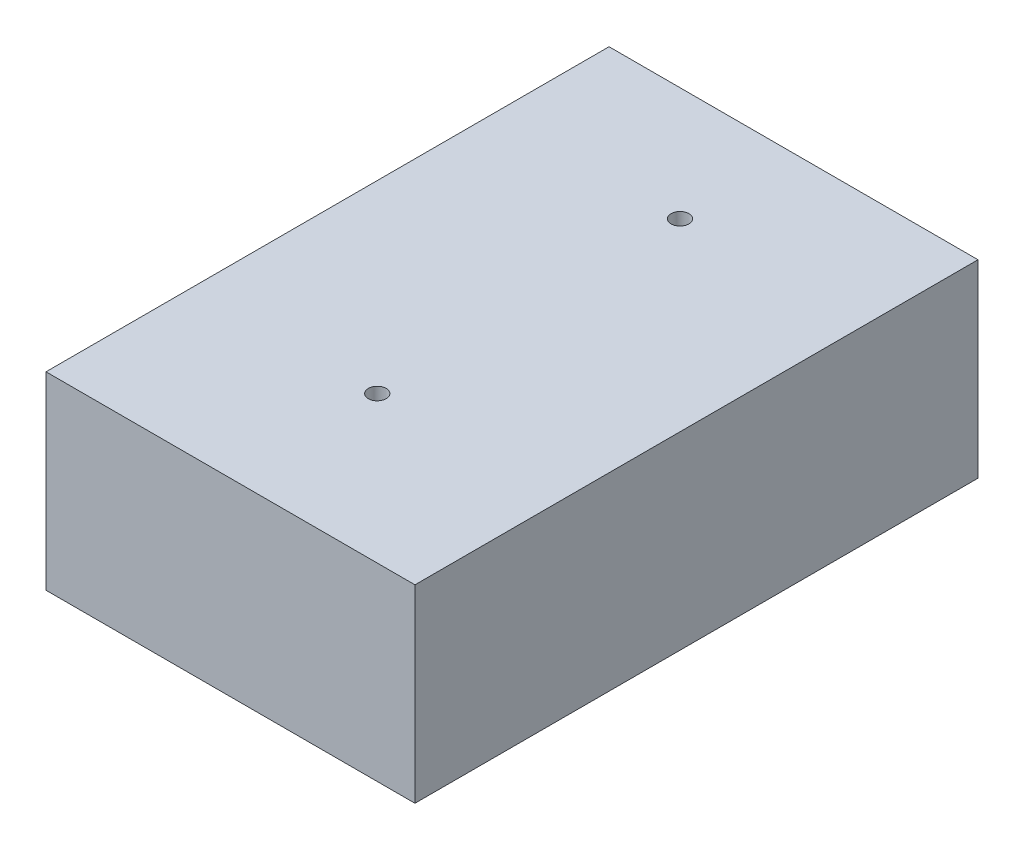
ISO-10303-21;
HEADER;
FILE_DESCRIPTION(('STEP AP214'),'2;1');
FILE_NAME('part.step','',(''),(''),'','','');
FILE_SCHEMA(('AUTOMOTIVE_DESIGN { 1 0 10303 214 1 1 1 1 }'));
ENDSEC;
DATA;
#1=APPLICATION_CONTEXT('core data for automotive mechanical design processes');
#2=APPLICATION_PROTOCOL_DEFINITION('international standard','automotive_design',2000,#1);
#3=PRODUCT_CONTEXT('',#1,'mechanical');
#4=PRODUCT('Part','Part','',(#3));
#5=PRODUCT_RELATED_PRODUCT_CATEGORY('part','',(#4));
#6=PRODUCT_DEFINITION_FORMATION('','',#4);
#7=PRODUCT_DEFINITION_CONTEXT('part definition',#1,'design');
#8=PRODUCT_DEFINITION('design','',#6,#7);
#9=PRODUCT_DEFINITION_SHAPE('','',#8);
#10=(LENGTH_UNIT() NAMED_UNIT(*) SI_UNIT(.MILLI.,.METRE.));
#11=(NAMED_UNIT(*) PLANE_ANGLE_UNIT() SI_UNIT($,.RADIAN.));
#12=(NAMED_UNIT(*) SI_UNIT($,.STERADIAN.) SOLID_ANGLE_UNIT());
#13=UNCERTAINTY_MEASURE_WITH_UNIT(LENGTH_MEASURE(1.E-05),#10,'distance_accuracy_value','');
#14=(GEOMETRIC_REPRESENTATION_CONTEXT(3) GLOBAL_UNCERTAINTY_ASSIGNED_CONTEXT((#13)) GLOBAL_UNIT_ASSIGNED_CONTEXT((#10,
#11,#12)) REPRESENTATION_CONTEXT('',''));
#15=CARTESIAN_POINT('',(0.,0.,0.));
#16=DIRECTION('',(0.,0.,1.));
#17=DIRECTION('',(1.,0.,0.));
#18=AXIS2_PLACEMENT_3D('',#15,#16,#17);
#19=CARTESIAN_POINT('',(30.95625,31.75,-47.2399444637279));
#20=DIRECTION('',(-1.,0.,0.));
#21=DIRECTION('',(0.,0.,1.));
#22=AXIS2_PLACEMENT_3D('',#19,#20,#21);
#23=PLANE('',#22);
#24=DIRECTION('',(0.,0.,-1.));
#25=VECTOR('',#24,1.);
#26=CARTESIAN_POINT('',(30.95625,0.,-47.2399444637279));
#27=LINE('',#26,#25);
#28=CARTESIAN_POINT('',(30.95625,0.,47.2399444637279));
#29=VERTEX_POINT('',#28);
#30=CARTESIAN_POINT('',(30.95625,0.,-47.2399444637279));
#31=VERTEX_POINT('',#30);
#32=EDGE_CURVE('E112',#29,#31,#27,.T.);
#33=ORIENTED_EDGE('',*,*,#32,.T.);
#34=DIRECTION('',(0.,-1.,0.));
#35=VECTOR('',#34,1.);
#36=CARTESIAN_POINT('',(30.95625,31.75,-47.2399444637279));
#37=LINE('',#36,#35);
#38=CARTESIAN_POINT('',(30.95625,31.75,-47.2399444637279));
#39=VERTEX_POINT('',#38);
#40=EDGE_CURVE('E11',#39,#31,#37,.T.);
#41=ORIENTED_EDGE('',*,*,#40,.F.);
#42=DIRECTION('',(0.,0.,-1.));
#43=VECTOR('',#42,1.);
#44=CARTESIAN_POINT('',(30.95625,31.75,-47.2399444637279));
#45=LINE('',#44,#43);
#46=CARTESIAN_POINT('',(30.95625,31.75,47.2399444637279));
#47=VERTEX_POINT('',#46);
#48=EDGE_CURVE('E100',#47,#39,#45,.T.);
#49=ORIENTED_EDGE('',*,*,#48,.F.);
#50=DIRECTION('',(0.,-1.,0.));
#51=VECTOR('',#50,1.);
#52=CARTESIAN_POINT('',(30.95625,31.75,47.2399444637279));
#53=LINE('',#52,#51);
#54=EDGE_CURVE('E108',#47,#29,#53,.T.);
#55=ORIENTED_EDGE('',*,*,#54,.T.);
#56=EDGE_LOOP('',(#33,#41,#49,#55));
#57=FACE_BOUND('',#56,.T.);
#58=ADVANCED_FACE('F49',(#57),#23,.F.);
#59=CARTESIAN_POINT('',(-30.95625,31.75,-47.2399444637279));
#60=DIRECTION('',(0.,0.,1.));
#61=DIRECTION('',(1.,0.,0.));
#62=AXIS2_PLACEMENT_3D('',#59,#60,#61);
#63=PLANE('',#62);
#64=DIRECTION('',(-1.,0.,0.));
#65=VECTOR('',#64,1.);
#66=CARTESIAN_POINT('',(-30.95625,0.,-47.2399444637279));
#67=LINE('',#66,#65);
#68=CARTESIAN_POINT('',(-30.95625,0.,-47.2399444637279));
#69=VERTEX_POINT('',#68);
#70=EDGE_CURVE('E104',#31,#69,#67,.T.);
#71=ORIENTED_EDGE('',*,*,#70,.T.);
#72=DIRECTION('',(0.,-1.,0.));
#73=VECTOR('',#72,1.);
#74=CARTESIAN_POINT('',(-30.95625,31.75,-47.2399444637279));
#75=LINE('',#74,#73);
#76=CARTESIAN_POINT('',(-30.95625,31.75,-47.2399444637279));
#77=VERTEX_POINT('',#76);
#78=EDGE_CURVE('E57',#77,#69,#75,.T.);
#79=ORIENTED_EDGE('',*,*,#78,.F.);
#80=DIRECTION('',(-1.,0.,0.));
#81=VECTOR('',#80,1.);
#82=CARTESIAN_POINT('',(-30.95625,31.75,-47.2399444637279));
#83=LINE('',#82,#81);
#84=EDGE_CURVE('E95',#39,#77,#83,.T.);
#85=ORIENTED_EDGE('',*,*,#84,.F.);
#86=ORIENTED_EDGE('',*,*,#40,.T.);
#87=EDGE_LOOP('',(#71,#79,#85,#86));
#88=FACE_BOUND('',#87,.T.);
#89=ADVANCED_FACE('F103',(#88),#63,.F.);
#90=CARTESIAN_POINT('',(-30.95625,31.75,-47.2399444637279));
#91=DIRECTION('',(1.,0.,0.));
#92=DIRECTION('',(0.,0.,-1.));
#93=AXIS2_PLACEMENT_3D('',#90,#91,#92);
#94=PLANE('',#93);
#95=DIRECTION('',(0.,0.,1.));
#96=VECTOR('',#95,1.);
#97=CARTESIAN_POINT('',(-30.95625,0.,-47.2399444637279));
#98=LINE('',#97,#96);
#99=CARTESIAN_POINT('',(-30.95625,0.,47.2399444637279));
#100=VERTEX_POINT('',#99);
#101=EDGE_CURVE('E82',#69,#100,#98,.T.);
#102=ORIENTED_EDGE('',*,*,#101,.T.);
#103=DIRECTION('',(0.,-1.,0.));
#104=VECTOR('',#103,1.);
#105=CARTESIAN_POINT('',(-30.95625,31.75,47.2399444637279));
#106=LINE('',#105,#104);
#107=CARTESIAN_POINT('',(-30.95625,31.75,47.2399444637279));
#108=VERTEX_POINT('',#107);
#109=EDGE_CURVE('E105',#108,#100,#106,.T.);
#110=ORIENTED_EDGE('',*,*,#109,.F.);
#111=DIRECTION('',(0.,0.,1.));
#112=VECTOR('',#111,1.);
#113=CARTESIAN_POINT('',(-30.95625,31.75,-47.2399444637279));
#114=LINE('',#113,#112);
#115=EDGE_CURVE('E98',#77,#108,#114,.T.);
#116=ORIENTED_EDGE('',*,*,#115,.F.);
#117=ORIENTED_EDGE('',*,*,#78,.T.);
#118=EDGE_LOOP('',(#102,#110,#116,#117));
#119=FACE_BOUND('',#118,.T.);
#120=ADVANCED_FACE('F106',(#119),#94,.F.);
#121=CARTESIAN_POINT('',(-30.95625,31.75,47.2399444637279));
#122=DIRECTION('',(0.,0.,-1.));
#123=DIRECTION('',(-1.,0.,0.));
#124=AXIS2_PLACEMENT_3D('',#121,#122,#123);
#125=PLANE('',#124);
#126=DIRECTION('',(1.,0.,0.));
#127=VECTOR('',#126,1.);
#128=CARTESIAN_POINT('',(-30.95625,0.,47.2399444637279));
#129=LINE('',#128,#127);
#130=EDGE_CURVE('E88',#100,#29,#129,.T.);
#131=ORIENTED_EDGE('',*,*,#130,.T.);
#132=ORIENTED_EDGE('',*,*,#54,.F.);
#133=DIRECTION('',(1.,0.,0.));
#134=VECTOR('',#133,1.);
#135=CARTESIAN_POINT('',(-30.95625,31.75,47.2399444637279));
#136=LINE('',#135,#134);
#137=EDGE_CURVE('E65',#108,#47,#136,.T.);
#138=ORIENTED_EDGE('',*,*,#137,.F.);
#139=ORIENTED_EDGE('',*,*,#109,.T.);
#140=EDGE_LOOP('',(#131,#132,#138,#139));
#141=FACE_BOUND('',#140,.T.);
#142=ADVANCED_FACE('F120',(#141),#125,.F.);
#143=CARTESIAN_POINT('',(0.,31.75,0.));
#144=DIRECTION('',(0.,1.,0.));
#145=DIRECTION('',(0.,0.,1.));
#146=AXIS2_PLACEMENT_3D('',#143,#144,#145);
#147=PLANE('',#146);
#148=CARTESIAN_POINT('',(0.,31.75,-28.1899444637279));
#149=DIRECTION('',(0.,1.,0.));
#150=DIRECTION('',(0.,0.,1.));
#151=AXIS2_PLACEMENT_3D('',#148,#149,#150);
#152=CIRCLE('',#151,1.5);
#153=CARTESIAN_POINT('',(0.,31.75,-26.6899444637279));
#154=VERTEX_POINT('',#153);
#155=EDGE_CURVE('E132',#154,#154,#152,.T.);
#156=ORIENTED_EDGE('',*,*,#155,.F.);
#157=EDGE_LOOP('',(#156));
#158=FACE_BOUND('',#157,.T.);
#159=CARTESIAN_POINT('',(0.,31.75,22.6100555362721));
#160=DIRECTION('',(0.,1.,0.));
#161=DIRECTION('',(0.,0.,1.));
#162=AXIS2_PLACEMENT_3D('',#159,#160,#161);
#163=CIRCLE('',#162,1.5);
#164=CARTESIAN_POINT('',(0.,31.75,24.1100555362721));
#165=VERTEX_POINT('',#164);
#166=EDGE_CURVE('E129',#165,#165,#163,.T.);
#167=ORIENTED_EDGE('',*,*,#166,.F.);
#168=EDGE_LOOP('',(#167));
#169=FACE_BOUND('',#168,.T.);
#170=ORIENTED_EDGE('',*,*,#48,.T.);
#171=ORIENTED_EDGE('',*,*,#84,.T.);
#172=ORIENTED_EDGE('',*,*,#115,.T.);
#173=ORIENTED_EDGE('',*,*,#137,.T.);
#174=EDGE_LOOP('',(#170,#171,#172,#173));
#175=FACE_BOUND('',#174,.T.);
#176=ADVANCED_FACE('F96',(#158,#169,#175),#147,.T.);
#177=CARTESIAN_POINT('',(0.,0.,0.));
#178=DIRECTION('',(0.,1.,0.));
#179=DIRECTION('',(0.,0.,1.));
#180=AXIS2_PLACEMENT_3D('',#177,#178,#179);
#181=PLANE('',#180);
#182=ORIENTED_EDGE('',*,*,#32,.F.);
#183=ORIENTED_EDGE('',*,*,#130,.F.);
#184=ORIENTED_EDGE('',*,*,#101,.F.);
#185=ORIENTED_EDGE('',*,*,#70,.F.);
#186=EDGE_LOOP('',(#182,#183,#184,#185));
#187=FACE_BOUND('',#186,.T.);
#188=ADVANCED_FACE('F123',(#187),#181,.F.);
#189=CARTESIAN_POINT('',(0.,29.21,22.6100555362721));
#190=DIRECTION('',(0.,1.,0.));
#191=DIRECTION('',(0.,0.,1.));
#192=AXIS2_PLACEMENT_3D('',#189,#190,#191);
#193=CYLINDRICAL_SURFACE('',#192,1.5);
#194=CARTESIAN_POINT('',(0.,29.21,22.6100555362721));
#195=DIRECTION('',(0.,1.,0.));
#196=DIRECTION('',(0.,0.,1.));
#197=AXIS2_PLACEMENT_3D('',#194,#195,#196);
#198=CIRCLE('',#197,1.5);
#199=CARTESIAN_POINT('',(0.,29.21,24.1100555362721));
#200=VERTEX_POINT('',#199);
#201=EDGE_CURVE('E126',#200,#200,#198,.T.);
#202=ORIENTED_EDGE('',*,*,#201,.F.);
#203=EDGE_LOOP('',(#202));
#204=FACE_BOUND('',#203,.T.);
#205=ORIENTED_EDGE('',*,*,#166,.T.);
#206=EDGE_LOOP('',(#205));
#207=FACE_BOUND('',#206,.T.);
#208=ADVANCED_FACE('F152',(#204,#207),#193,.F.);
#209=CARTESIAN_POINT('',(0.,29.21,22.6100555362721));
#210=DIRECTION('',(0.,1.,0.));
#211=DIRECTION('',(0.,0.,1.));
#212=AXIS2_PLACEMENT_3D('',#209,#210,#211);
#213=PLANE('',#212);
#214=ORIENTED_EDGE('',*,*,#201,.T.);
#215=EDGE_LOOP('',(#214));
#216=FACE_BOUND('',#215,.T.);
#217=ADVANCED_FACE('F143',(#216),#213,.T.);
#218=CARTESIAN_POINT('',(0.,29.21,-28.1899444637279));
#219=DIRECTION('',(0.,1.,0.));
#220=DIRECTION('',(0.,0.,1.));
#221=AXIS2_PLACEMENT_3D('',#218,#219,#220);
#222=CYLINDRICAL_SURFACE('',#221,1.5);
#223=CARTESIAN_POINT('',(0.,29.21,-28.1899444637279));
#224=DIRECTION('',(0.,1.,0.));
#225=DIRECTION('',(0.,0.,1.));
#226=AXIS2_PLACEMENT_3D('',#223,#224,#225);
#227=CIRCLE('',#226,1.5);
#228=CARTESIAN_POINT('',(0.,29.21,-26.6899444637279));
#229=VERTEX_POINT('',#228);
#230=EDGE_CURVE('E115',#229,#229,#227,.T.);
#231=ORIENTED_EDGE('',*,*,#230,.F.);
#232=EDGE_LOOP('',(#231));
#233=FACE_BOUND('',#232,.T.);
#234=ORIENTED_EDGE('',*,*,#155,.T.);
#235=EDGE_LOOP('',(#234));
#236=FACE_BOUND('',#235,.T.);
#237=ADVANCED_FACE('F140',(#233,#236),#222,.F.);
#238=CARTESIAN_POINT('',(0.,29.21,-28.1899444637279));
#239=DIRECTION('',(0.,1.,0.));
#240=DIRECTION('',(0.,0.,1.));
#241=AXIS2_PLACEMENT_3D('',#238,#239,#240);
#242=PLANE('',#241);
#243=ORIENTED_EDGE('',*,*,#230,.T.);
#244=EDGE_LOOP('',(#243));
#245=FACE_BOUND('',#244,.T.);
#246=ADVANCED_FACE('F138',(#245),#242,.T.);
#247=CLOSED_SHELL('',(#58,#89,#120,#142,#176,#188,#208,#217,#237,#246));
#248=MANIFOLD_SOLID_BREP('B2',#247);
#249=ADVANCED_BREP_SHAPE_REPRESENTATION('',(#18,#248),#14);
#250=SHAPE_DEFINITION_REPRESENTATION(#9,#249);
ENDSEC;
END-ISO-10303-21;
